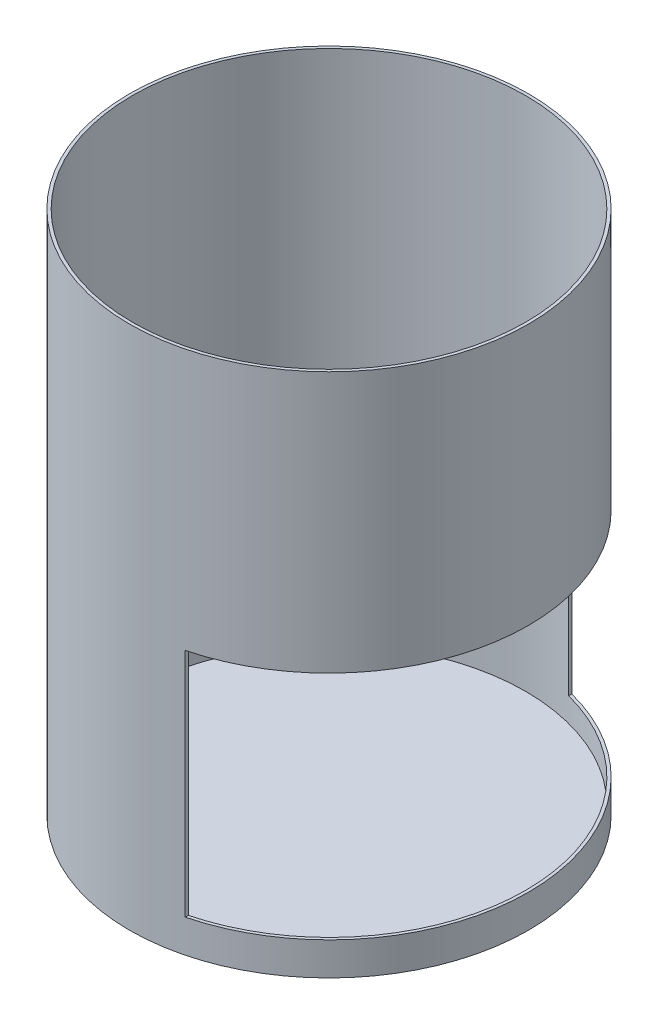
ISO-10303-21;
HEADER;
FILE_DESCRIPTION(('STEP AP214'),'2;1');
FILE_NAME('part.step','',(''),(''),'','','');
FILE_SCHEMA(('AUTOMOTIVE_DESIGN { 1 0 10303 214 1 1 1 1 }'));
ENDSEC;
DATA;
#1=APPLICATION_CONTEXT('core data for automotive mechanical design processes');
#2=APPLICATION_PROTOCOL_DEFINITION('international standard','automotive_design',2000,#1);
#3=PRODUCT_CONTEXT('',#1,'mechanical');
#4=PRODUCT('Part','Part','',(#3));
#5=PRODUCT_RELATED_PRODUCT_CATEGORY('part','',(#4));
#6=PRODUCT_DEFINITION_FORMATION('','',#4);
#7=PRODUCT_DEFINITION_CONTEXT('part definition',#1,'design');
#8=PRODUCT_DEFINITION('design','',#6,#7);
#9=PRODUCT_DEFINITION_SHAPE('','',#8);
#10=(LENGTH_UNIT() NAMED_UNIT(*) SI_UNIT(.MILLI.,.METRE.));
#11=(NAMED_UNIT(*) PLANE_ANGLE_UNIT() SI_UNIT($,.RADIAN.));
#12=(NAMED_UNIT(*) SI_UNIT($,.STERADIAN.) SOLID_ANGLE_UNIT());
#13=UNCERTAINTY_MEASURE_WITH_UNIT(LENGTH_MEASURE(1.E-05),#10,'distance_accuracy_value','');
#14=(GEOMETRIC_REPRESENTATION_CONTEXT(3) GLOBAL_UNCERTAINTY_ASSIGNED_CONTEXT((#13)) GLOBAL_UNIT_ASSIGNED_CONTEXT((#10,
#11,#12)) REPRESENTATION_CONTEXT('',''));
#15=CARTESIAN_POINT('',(0.,0.,0.));
#16=DIRECTION('',(0.,0.,1.));
#17=DIRECTION('',(1.,0.,0.));
#18=AXIS2_PLACEMENT_3D('',#15,#16,#17);
#19=CARTESIAN_POINT('',(0.,175.,0.));
#20=DIRECTION('',(0.,-1.,0.));
#21=DIRECTION('',(0.,0.,-1.));
#22=AXIS2_PLACEMENT_3D('',#19,#20,#21);
#23=CYLINDRICAL_SURFACE('',#22,66.5);
#24=CARTESIAN_POINT('',(0.,0.,0.));
#25=DIRECTION('',(0.,1.,0.));
#26=DIRECTION('',(0.,0.,1.));
#27=AXIS2_PLACEMENT_3D('',#24,#25,#26);
#28=CIRCLE('',#27,66.5);
#29=CARTESIAN_POINT('',(0.,0.,66.5));
#30=VERTEX_POINT('',#29);
#31=EDGE_CURVE('E101',#30,#30,#28,.T.);
#32=ORIENTED_EDGE('',*,*,#31,.T.);
#33=EDGE_LOOP('',(#32));
#34=FACE_BOUND('',#33,.T.);
#35=CARTESIAN_POINT('',(0.,175.,0.));
#36=DIRECTION('',(0.,1.,0.));
#37=DIRECTION('',(0.,0.,1.));
#38=AXIS2_PLACEMENT_3D('',#35,#36,#37);
#39=CIRCLE('',#38,66.5);
#40=CARTESIAN_POINT('',(0.,175.,66.5));
#41=VERTEX_POINT('',#40);
#42=EDGE_CURVE('E102',#41,#41,#39,.T.);
#43=ORIENTED_EDGE('',*,*,#42,.F.);
#44=EDGE_LOOP('',(#43));
#45=FACE_BOUND('',#44,.T.);
#46=CARTESIAN_POINT('',(0.,88.,0.));
#47=DIRECTION('',(0.,-1.,0.));
#48=DIRECTION('',(0.,0.,-1.));
#49=AXIS2_PLACEMENT_3D('',#46,#47,#48);
#50=CIRCLE('',#49,66.5);
#51=CARTESIAN_POINT('',(16.5,88.,-64.4204936336256));
#52=VERTEX_POINT('',#51);
#53=CARTESIAN_POINT('',(16.5,88.,64.4204936336256));
#54=VERTEX_POINT('',#53);
#55=EDGE_CURVE('E85',#52,#54,#50,.T.);
#56=ORIENTED_EDGE('',*,*,#55,.F.);
#57=DIRECTION('',(0.,-1.,0.));
#58=VECTOR('',#57,1.);
#59=CARTESIAN_POINT('',(16.5,175.,-64.4204936336256));
#60=LINE('',#59,#58);
#61=CARTESIAN_POINT('',(16.5,11.,-64.4204936336256));
#62=VERTEX_POINT('',#61);
#63=EDGE_CURVE('E54',#62,#52,#60,.F.);
#64=ORIENTED_EDGE('',*,*,#63,.F.);
#65=CARTESIAN_POINT('',(0.,11.,0.));
#66=DIRECTION('',(0.,1.,0.));
#67=DIRECTION('',(-1.,0.,0.));
#68=AXIS2_PLACEMENT_3D('',#65,#66,#67);
#69=CIRCLE('',#68,66.5);
#70=CARTESIAN_POINT('',(16.5,11.,64.4204936336256));
#71=VERTEX_POINT('',#70);
#72=EDGE_CURVE('E88',#71,#62,#69,.T.);
#73=ORIENTED_EDGE('',*,*,#72,.F.);
#74=DIRECTION('',(0.,-1.,0.));
#75=VECTOR('',#74,1.);
#76=CARTESIAN_POINT('',(16.5,175.,64.4204936336256));
#77=LINE('',#76,#75);
#78=EDGE_CURVE('E75',#54,#71,#77,.T.);
#79=ORIENTED_EDGE('',*,*,#78,.F.);
#80=EDGE_LOOP('',(#56,#64,#73,#79));
#81=FACE_BOUND('',#80,.T.);
#82=ADVANCED_FACE('F33',(#34,#45,#81),#23,.T.);
#83=CARTESIAN_POINT('',(0.,175.,0.));
#84=DIRECTION('',(0.,-1.,0.));
#85=DIRECTION('',(0.,0.,-1.));
#86=AXIS2_PLACEMENT_3D('',#83,#84,#85);
#87=CYLINDRICAL_SURFACE('',#86,65.5);
#88=CARTESIAN_POINT('',(0.,3.,0.));
#89=DIRECTION('',(0.,1.,0.));
#90=DIRECTION('',(0.,0.,1.));
#91=AXIS2_PLACEMENT_3D('',#88,#89,#90);
#92=CIRCLE('',#91,65.5);
#93=CARTESIAN_POINT('',(0.,3.,65.5));
#94=VERTEX_POINT('',#93);
#95=EDGE_CURVE('E105',#94,#94,#92,.T.);
#96=ORIENTED_EDGE('',*,*,#95,.F.);
#97=EDGE_LOOP('',(#96));
#98=FACE_BOUND('',#97,.T.);
#99=CARTESIAN_POINT('',(0.,175.,0.));
#100=DIRECTION('',(0.,1.,0.));
#101=DIRECTION('',(0.,0.,1.));
#102=AXIS2_PLACEMENT_3D('',#99,#100,#101);
#103=CIRCLE('',#102,65.5);
#104=CARTESIAN_POINT('',(0.,175.,65.5));
#105=VERTEX_POINT('',#104);
#106=EDGE_CURVE('E98',#105,#105,#103,.T.);
#107=ORIENTED_EDGE('',*,*,#106,.T.);
#108=EDGE_LOOP('',(#107));
#109=FACE_BOUND('',#108,.T.);
#110=DIRECTION('',(0.,-1.,0.));
#111=VECTOR('',#110,1.);
#112=CARTESIAN_POINT('',(16.5,175.,-63.3876959669619));
#113=LINE('',#112,#111);
#114=CARTESIAN_POINT('',(16.5,11.,-63.3876959669619));
#115=VERTEX_POINT('',#114);
#116=CARTESIAN_POINT('',(16.5,88.,-63.3876959669619));
#117=VERTEX_POINT('',#116);
#118=EDGE_CURVE('E111',#115,#117,#113,.F.);
#119=ORIENTED_EDGE('',*,*,#118,.T.);
#120=CARTESIAN_POINT('',(0.,88.,0.));
#121=DIRECTION('',(0.,-1.,0.));
#122=DIRECTION('',(0.,0.,-1.));
#123=AXIS2_PLACEMENT_3D('',#120,#121,#122);
#124=CIRCLE('',#123,65.5);
#125=CARTESIAN_POINT('',(16.5,88.,63.3876959669619));
#126=VERTEX_POINT('',#125);
#127=EDGE_CURVE('E11',#117,#126,#124,.T.);
#128=ORIENTED_EDGE('',*,*,#127,.T.);
#129=DIRECTION('',(0.,-1.,0.));
#130=VECTOR('',#129,1.);
#131=CARTESIAN_POINT('',(16.5,175.,63.3876959669619));
#132=LINE('',#131,#130);
#133=CARTESIAN_POINT('',(16.5,11.,63.3876959669619));
#134=VERTEX_POINT('',#133);
#135=EDGE_CURVE('E40',#126,#134,#132,.T.);
#136=ORIENTED_EDGE('',*,*,#135,.T.);
#137=CARTESIAN_POINT('',(0.,11.,0.));
#138=DIRECTION('',(0.,1.,0.));
#139=DIRECTION('',(-1.,0.,0.));
#140=AXIS2_PLACEMENT_3D('',#137,#138,#139);
#141=CIRCLE('',#140,65.5);
#142=EDGE_CURVE('E90',#134,#115,#141,.T.);
#143=ORIENTED_EDGE('',*,*,#142,.T.);
#144=EDGE_LOOP('',(#119,#128,#136,#143));
#145=FACE_BOUND('',#144,.T.);
#146=ADVANCED_FACE('F114',(#98,#109,#145),#87,.F.);
#147=CARTESIAN_POINT('',(0.,175.,0.));
#148=DIRECTION('',(0.,1.,0.));
#149=DIRECTION('',(0.,0.,1.));
#150=AXIS2_PLACEMENT_3D('',#147,#148,#149);
#151=PLANE('',#150);
#152=ORIENTED_EDGE('',*,*,#42,.T.);
#153=EDGE_LOOP('',(#152));
#154=FACE_BOUND('',#153,.T.);
#155=ORIENTED_EDGE('',*,*,#106,.F.);
#156=EDGE_LOOP('',(#155));
#157=FACE_BOUND('',#156,.T.);
#158=ADVANCED_FACE('F131',(#154,#157),#151,.T.);
#159=CARTESIAN_POINT('',(0.,0.,0.));
#160=DIRECTION('',(0.,1.,0.));
#161=DIRECTION('',(0.,0.,1.));
#162=AXIS2_PLACEMENT_3D('',#159,#160,#161);
#163=PLANE('',#162);
#164=ORIENTED_EDGE('',*,*,#31,.F.);
#165=EDGE_LOOP('',(#164));
#166=FACE_BOUND('',#165,.T.);
#167=ADVANCED_FACE('F140',(#166),#163,.F.);
#168=CARTESIAN_POINT('',(0.,3.,0.));
#169=DIRECTION('',(0.,1.,0.));
#170=DIRECTION('',(0.,0.,1.));
#171=AXIS2_PLACEMENT_3D('',#168,#169,#170);
#172=PLANE('',#171);
#173=ORIENTED_EDGE('',*,*,#95,.T.);
#174=EDGE_LOOP('',(#173));
#175=FACE_BOUND('',#174,.T.);
#176=ADVANCED_FACE('F147',(#175),#172,.T.);
#177=CARTESIAN_POINT('',(66.5,88.,66.5));
#178=DIRECTION('',(0.,-1.,0.));
#179=DIRECTION('',(0.,0.,-1.));
#180=AXIS2_PLACEMENT_3D('',#177,#178,#179);
#181=PLANE('',#180);
#182=ORIENTED_EDGE('',*,*,#55,.T.);
#183=DIRECTION('',(0.,0.,-1.));
#184=VECTOR('',#183,1.);
#185=CARTESIAN_POINT('',(16.5,88.,66.5));
#186=LINE('',#185,#184);
#187=EDGE_CURVE('E81',#54,#126,#186,.T.);
#188=ORIENTED_EDGE('',*,*,#187,.T.);
#189=ORIENTED_EDGE('',*,*,#127,.F.);
#190=EDGE_CURVE('E91',#117,#52,#186,.T.);
#191=ORIENTED_EDGE('',*,*,#190,.T.);
#192=EDGE_LOOP('',(#182,#188,#189,#191));
#193=FACE_BOUND('',#192,.T.);
#194=ADVANCED_FACE('F116',(#193),#181,.T.);
#195=CARTESIAN_POINT('',(16.5,88.,66.5));
#196=DIRECTION('',(1.,0.,0.));
#197=DIRECTION('',(0.,1.,0.));
#198=AXIS2_PLACEMENT_3D('',#195,#196,#197);
#199=PLANE('',#198);
#200=ORIENTED_EDGE('',*,*,#78,.T.);
#201=DIRECTION('',(0.,0.,-1.));
#202=VECTOR('',#201,1.);
#203=CARTESIAN_POINT('',(16.5,11.,66.5));
#204=LINE('',#203,#202);
#205=EDGE_CURVE('E78',#71,#134,#204,.T.);
#206=ORIENTED_EDGE('',*,*,#205,.T.);
#207=ORIENTED_EDGE('',*,*,#135,.F.);
#208=ORIENTED_EDGE('',*,*,#187,.F.);
#209=EDGE_LOOP('',(#200,#206,#207,#208));
#210=FACE_BOUND('',#209,.T.);
#211=ADVANCED_FACE('F77',(#210),#199,.T.);
#212=ORIENTED_EDGE('',*,*,#63,.T.);
#213=ORIENTED_EDGE('',*,*,#190,.F.);
#214=ORIENTED_EDGE('',*,*,#118,.F.);
#215=EDGE_CURVE('E47',#115,#62,#204,.T.);
#216=ORIENTED_EDGE('',*,*,#215,.T.);
#217=EDGE_LOOP('',(#212,#213,#214,#216));
#218=FACE_BOUND('',#217,.T.);
#219=ADVANCED_FACE('F117',(#218),#199,.T.);
#220=CARTESIAN_POINT('',(66.5,11.,66.5));
#221=DIRECTION('',(0.,1.,0.));
#222=DIRECTION('',(-1.,0.,0.));
#223=AXIS2_PLACEMENT_3D('',#220,#221,#222);
#224=PLANE('',#223);
#225=ORIENTED_EDGE('',*,*,#72,.T.);
#226=ORIENTED_EDGE('',*,*,#215,.F.);
#227=ORIENTED_EDGE('',*,*,#142,.F.);
#228=ORIENTED_EDGE('',*,*,#205,.F.);
#229=EDGE_LOOP('',(#225,#226,#227,#228));
#230=FACE_BOUND('',#229,.T.);
#231=ADVANCED_FACE('F87',(#230),#224,.T.);
#232=CLOSED_SHELL('',(#82,#146,#158,#167,#176,#194,#211,#219,#231));
#233=MANIFOLD_SOLID_BREP('B2',#232);
#234=ADVANCED_BREP_SHAPE_REPRESENTATION('',(#18,#233),#14);
#235=SHAPE_DEFINITION_REPRESENTATION(#9,#234);
ENDSEC;
END-ISO-10303-21;
